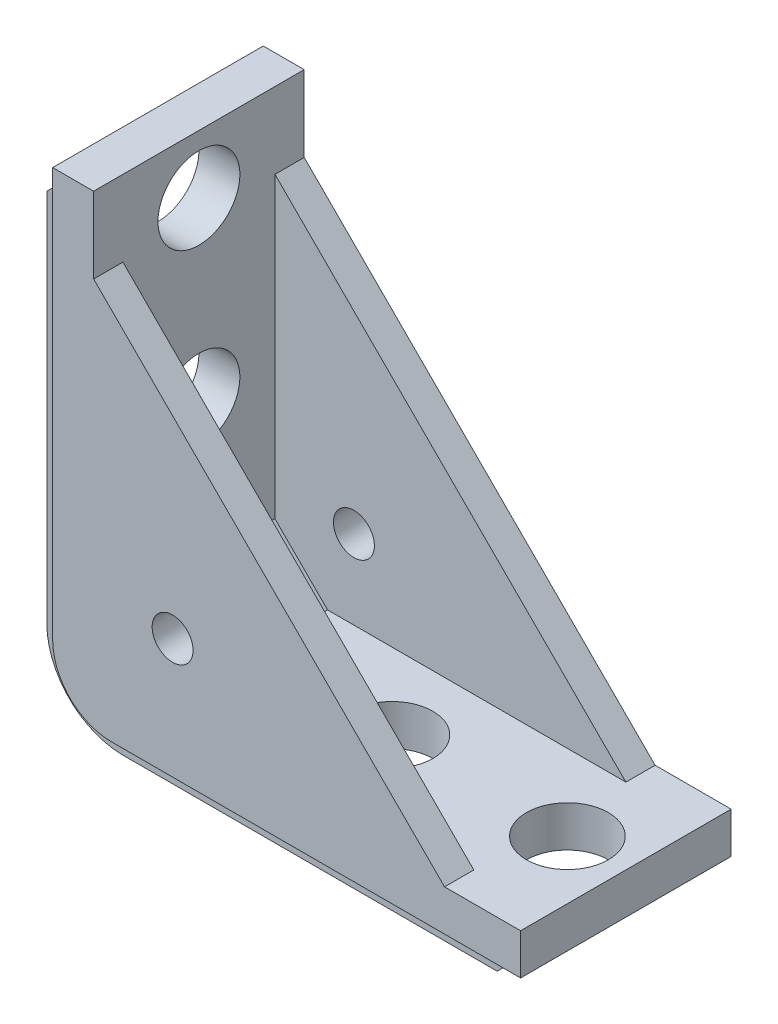
ISO-10303-21;
HEADER;
FILE_DESCRIPTION(('STEP AP214'),'2;1');
FILE_NAME('part.step','',(''),(''),'','','');
FILE_SCHEMA(('AUTOMOTIVE_DESIGN { 1 0 10303 214 1 1 1 1 }'));
ENDSEC;
DATA;
#1=APPLICATION_CONTEXT('core data for automotive mechanical design processes');
#2=APPLICATION_PROTOCOL_DEFINITION('international standard','automotive_design',2000,#1);
#3=PRODUCT_CONTEXT('',#1,'mechanical');
#4=PRODUCT('Part','Part','',(#3));
#5=PRODUCT_RELATED_PRODUCT_CATEGORY('part','',(#4));
#6=PRODUCT_DEFINITION_FORMATION('','',#4);
#7=PRODUCT_DEFINITION_CONTEXT('part definition',#1,'design');
#8=PRODUCT_DEFINITION('design','',#6,#7);
#9=PRODUCT_DEFINITION_SHAPE('','',#8);
#10=(LENGTH_UNIT() NAMED_UNIT(*) SI_UNIT(.MILLI.,.METRE.));
#11=(NAMED_UNIT(*) PLANE_ANGLE_UNIT() SI_UNIT($,.RADIAN.));
#12=(NAMED_UNIT(*) SI_UNIT($,.STERADIAN.) SOLID_ANGLE_UNIT());
#13=UNCERTAINTY_MEASURE_WITH_UNIT(LENGTH_MEASURE(1.E-05),#10,'distance_accuracy_value','');
#14=(GEOMETRIC_REPRESENTATION_CONTEXT(3) GLOBAL_UNCERTAINTY_ASSIGNED_CONTEXT((#13)) GLOBAL_UNIT_ASSIGNED_CONTEXT((#10,
#11,#12)) REPRESENTATION_CONTEXT('',''));
#15=CARTESIAN_POINT('',(0.,0.,0.));
#16=DIRECTION('',(0.,0.,1.));
#17=DIRECTION('',(1.,0.,0.));
#18=AXIS2_PLACEMENT_3D('',#15,#16,#17);
#19=CARTESIAN_POINT('',(35.,5.,-41.5));
#20=DIRECTION('',(-0.707106781186548,-0.707106781186547,0.));
#21=DIRECTION('',(0.707106781186547,-0.707106781186548,0.));
#22=AXIS2_PLACEMENT_3D('',#19,#20,#21);
#23=PLANE('',#22);
#24=DIRECTION('',(-0.707106781186547,0.707106781186548,0.));
#25=VECTOR('',#24,1.);
#26=CARTESIAN_POINT('',(35.,5.,-15.5));
#27=LINE('',#26,#25);
#28=CARTESIAN_POINT('',(35.,5.,-15.5));
#29=VERTEX_POINT('',#28);
#30=CARTESIAN_POINT('',(5.,35.,-15.5));
#31=VERTEX_POINT('',#30);
#32=EDGE_CURVE('E261',#29,#31,#27,.T.);
#33=ORIENTED_EDGE('',*,*,#32,.F.);
#34=DIRECTION('',(0.,0.,1.));
#35=VECTOR('',#34,1.);
#36=CARTESIAN_POINT('',(35.,5.,-41.5));
#37=LINE('',#36,#35);
#38=CARTESIAN_POINT('',(35.,5.,-18.));
#39=VERTEX_POINT('',#38);
#40=EDGE_CURVE('E341',#39,#29,#37,.T.);
#41=ORIENTED_EDGE('',*,*,#40,.F.);
#42=DIRECTION('',(0.707106781186547,-0.707106781186548,0.));
#43=VECTOR('',#42,1.);
#44=CARTESIAN_POINT('',(-0.75,40.75,-18.));
#45=LINE('',#44,#43);
#46=CARTESIAN_POINT('',(5.,35.,-18.));
#47=VERTEX_POINT('',#46);
#48=EDGE_CURVE('E362',#47,#39,#45,.T.);
#49=ORIENTED_EDGE('',*,*,#48,.F.);
#50=DIRECTION('',(0.,0.,1.));
#51=VECTOR('',#50,1.);
#52=CARTESIAN_POINT('',(5.,35.,-41.5));
#53=LINE('',#52,#51);
#54=EDGE_CURVE('E333',#47,#31,#53,.T.);
#55=ORIENTED_EDGE('',*,*,#54,.T.);
#56=EDGE_LOOP('',(#33,#41,#49,#55));
#57=FACE_BOUND('',#56,.T.);
#58=ADVANCED_FACE('F42',(#57),#23,.F.);
#59=CARTESIAN_POINT('',(0.,0.,-18.));
#60=DIRECTION('',(0.,-1.,0.));
#61=DIRECTION('',(0.,0.,-1.));
#62=AXIS2_PLACEMENT_3D('',#59,#60,#61);
#63=PLANE('',#62);
#64=DIRECTION('',(-1.,0.,0.));
#65=VECTOR('',#64,1.);
#66=CARTESIAN_POINT('',(0.,0.,-4.));
#67=LINE('',#66,#65);
#68=CARTESIAN_POINT('',(38.5,0.,-4.));
#69=VERTEX_POINT('',#68);
#70=CARTESIAN_POINT('',(6.5,0.,-4.));
#71=VERTEX_POINT('',#70);
#72=EDGE_CURVE('E295',#69,#71,#67,.T.);
#73=ORIENTED_EDGE('',*,*,#72,.F.);
#74=DIRECTION('',(0.,0.,1.));
#75=VECTOR('',#74,1.);
#76=CARTESIAN_POINT('',(38.5,0.,-18.));
#77=LINE('',#76,#75);
#78=CARTESIAN_POINT('',(38.5,0.,-1.));
#79=VERTEX_POINT('',#78);
#80=EDGE_CURVE('E417',#69,#79,#77,.T.);
#81=ORIENTED_EDGE('',*,*,#80,.T.);
#82=DIRECTION('',(1.,0.,0.));
#83=VECTOR('',#82,1.);
#84=CARTESIAN_POINT('',(0.,0.,-1.));
#85=LINE('',#84,#83);
#86=CARTESIAN_POINT('',(6.5,0.,-1.));
#87=VERTEX_POINT('',#86);
#88=EDGE_CURVE('E365',#87,#79,#85,.T.);
#89=ORIENTED_EDGE('',*,*,#88,.F.);
#90=DIRECTION('',(0.,0.,1.));
#91=VECTOR('',#90,1.);
#92=CARTESIAN_POINT('',(6.5,0.,-4.));
#93=LINE('',#92,#91);
#94=EDGE_CURVE('E373',#87,#71,#93,.F.);
#95=ORIENTED_EDGE('',*,*,#94,.T.);
#96=EDGE_LOOP('',(#73,#81,#89,#95));
#97=FACE_BOUND('',#96,.T.);
#98=ADVANCED_FACE('F488',(#97),#63,.T.);
#99=CARTESIAN_POINT('',(1.5,43.,1.5));
#100=DIRECTION('',(1.,0.,0.));
#101=DIRECTION('',(0.,0.,-1.));
#102=AXIS2_PLACEMENT_3D('',#99,#100,#101);
#103=PLANE('',#102);
#104=CARTESIAN_POINT('',(1.5,36.5,-9.));
#105=DIRECTION('',(-1.,0.,0.));
#106=DIRECTION('',(0.,0.,1.));
#107=AXIS2_PLACEMENT_3D('',#104,#105,#106);
#108=CIRCLE('',#107,3.5);
#109=CARTESIAN_POINT('',(1.5,36.5,-5.5));
#110=VERTEX_POINT('',#109);
#111=EDGE_CURVE('E446',#110,#110,#108,.T.);
#112=ORIENTED_EDGE('',*,*,#111,.F.);
#113=EDGE_LOOP('',(#112));
#114=FACE_BOUND('',#113,.T.);
#115=CARTESIAN_POINT('',(1.5,21.5,-9.));
#116=DIRECTION('',(-1.,0.,0.));
#117=DIRECTION('',(0.,0.,1.));
#118=AXIS2_PLACEMENT_3D('',#115,#116,#117);
#119=CIRCLE('',#118,3.5);
#120=CARTESIAN_POINT('',(1.5,21.5,-5.5));
#121=VERTEX_POINT('',#120);
#122=EDGE_CURVE('E443',#121,#121,#119,.T.);
#123=ORIENTED_EDGE('',*,*,#122,.F.);
#124=EDGE_LOOP('',(#123));
#125=FACE_BOUND('',#124,.T.);
#126=DIRECTION('',(0.,-1.,0.));
#127=VECTOR('',#126,1.);
#128=CARTESIAN_POINT('',(1.5,40.,-1.));
#129=LINE('',#128,#127);
#130=CARTESIAN_POINT('',(1.5,40.,-1.));
#131=VERTEX_POINT('',#130);
#132=CARTESIAN_POINT('',(1.5,6.5,-1.));
#133=VERTEX_POINT('',#132);
#134=EDGE_CURVE('E312',#131,#133,#129,.T.);
#135=ORIENTED_EDGE('',*,*,#134,.T.);
#136=DIRECTION('',(0.,0.,1.));
#137=VECTOR('',#136,1.);
#138=CARTESIAN_POINT('',(1.5,6.5,1.5));
#139=LINE('',#138,#137);
#140=CARTESIAN_POINT('',(1.5,6.5,0.));
#141=VERTEX_POINT('',#140);
#142=EDGE_CURVE('E387',#133,#141,#139,.T.);
#143=ORIENTED_EDGE('',*,*,#142,.T.);
#144=DIRECTION('',(0.,-1.,0.));
#145=VECTOR('',#144,1.);
#146=CARTESIAN_POINT('',(1.5,41.5,0.));
#147=LINE('',#146,#145);
#148=CARTESIAN_POINT('',(1.5,41.5,0.));
#149=VERTEX_POINT('',#148);
#150=EDGE_CURVE('E315',#149,#141,#147,.T.);
#151=ORIENTED_EDGE('',*,*,#150,.F.);
#152=DIRECTION('',(0.,0.,1.));
#153=VECTOR('',#152,1.);
#154=CARTESIAN_POINT('',(1.5,41.5,-18.));
#155=LINE('',#154,#153);
#156=CARTESIAN_POINT('',(1.5,41.5,-18.));
#157=VERTEX_POINT('',#156);
#158=EDGE_CURVE('E320',#157,#149,#155,.T.);
#159=ORIENTED_EDGE('',*,*,#158,.F.);
#160=DIRECTION('',(0.,1.,0.));
#161=VECTOR('',#160,1.);
#162=CARTESIAN_POINT('',(1.5,41.5,-18.));
#163=LINE('',#162,#161);
#164=CARTESIAN_POINT('',(1.5,6.5,-18.));
#165=VERTEX_POINT('',#164);
#166=EDGE_CURVE('E322',#165,#157,#163,.T.);
#167=ORIENTED_EDGE('',*,*,#166,.F.);
#168=DIRECTION('',(0.,0.,1.));
#169=VECTOR('',#168,1.);
#170=CARTESIAN_POINT('',(1.5,6.5,1.5));
#171=LINE('',#170,#169);
#172=CARTESIAN_POINT('',(1.5,6.5,-17.));
#173=VERTEX_POINT('',#172);
#174=EDGE_CURVE('E382',#165,#173,#171,.T.);
#175=ORIENTED_EDGE('',*,*,#174,.T.);
#176=DIRECTION('',(0.,1.,0.));
#177=VECTOR('',#176,1.);
#178=CARTESIAN_POINT('',(1.5,40.,-17.));
#179=LINE('',#178,#177);
#180=CARTESIAN_POINT('',(1.5,40.,-17.));
#181=VERTEX_POINT('',#180);
#182=EDGE_CURVE('E304',#173,#181,#179,.T.);
#183=ORIENTED_EDGE('',*,*,#182,.T.);
#184=DIRECTION('',(0.,0.,1.));
#185=VECTOR('',#184,1.);
#186=CARTESIAN_POINT('',(1.5,40.,-17.));
#187=LINE('',#186,#185);
#188=CARTESIAN_POINT('',(1.5,40.,-14.));
#189=VERTEX_POINT('',#188);
#190=EDGE_CURVE('E309',#181,#189,#187,.T.);
#191=ORIENTED_EDGE('',*,*,#190,.T.);
#192=DIRECTION('',(0.,-1.,0.));
#193=VECTOR('',#192,1.);
#194=CARTESIAN_POINT('',(1.5,-1.30665241122766,-14.));
#195=LINE('',#194,#193);
#196=CARTESIAN_POINT('',(1.5,6.5,-14.));
#197=VERTEX_POINT('',#196);
#198=EDGE_CURVE('E288',#189,#197,#195,.T.);
#199=ORIENTED_EDGE('',*,*,#198,.T.);
#200=DIRECTION('',(0.,0.,-1.));
#201=VECTOR('',#200,1.);
#202=CARTESIAN_POINT('',(1.5,6.5,1.5));
#203=LINE('',#202,#201);
#204=CARTESIAN_POINT('',(1.5,6.5,-4.));
#205=VERTEX_POINT('',#204);
#206=EDGE_CURVE('E385',#197,#205,#203,.F.);
#207=ORIENTED_EDGE('',*,*,#206,.T.);
#208=DIRECTION('',(0.,1.,0.));
#209=VECTOR('',#208,1.);
#210=CARTESIAN_POINT('',(1.5,41.5,-4.));
#211=LINE('',#210,#209);
#212=CARTESIAN_POINT('',(1.5,40.,-4.));
#213=VERTEX_POINT('',#212);
#214=EDGE_CURVE('E291',#205,#213,#211,.T.);
#215=ORIENTED_EDGE('',*,*,#214,.T.);
#216=EDGE_CURVE('E307',#213,#131,#187,.T.);
#217=ORIENTED_EDGE('',*,*,#216,.T.);
#218=EDGE_LOOP('',(#135,#143,#151,#159,#167,#175,#183,#191,#199,#207,#215,#217));
#219=FACE_BOUND('',#218,.T.);
#220=ADVANCED_FACE('F495',(#114,#125,#219),#103,.F.);
#221=DIRECTION('',(-1.,0.,0.));
#222=VECTOR('',#221,1.);
#223=CARTESIAN_POINT('',(0.,0.,-17.));
#224=LINE('',#223,#222);
#225=CARTESIAN_POINT('',(38.5,0.,-17.));
#226=VERTEX_POINT('',#225);
#227=CARTESIAN_POINT('',(6.5,0.,-17.));
#228=VERTEX_POINT('',#227);
#229=EDGE_CURVE('E368',#226,#228,#224,.T.);
#230=ORIENTED_EDGE('',*,*,#229,.F.);
#231=DIRECTION('',(0.,0.,1.));
#232=VECTOR('',#231,1.);
#233=CARTESIAN_POINT('',(38.5,0.,-18.));
#234=LINE('',#233,#232);
#235=CARTESIAN_POINT('',(38.5,0.,-14.));
#236=VERTEX_POINT('',#235);
#237=EDGE_CURVE('E428',#226,#236,#234,.T.);
#238=ORIENTED_EDGE('',*,*,#237,.T.);
#239=DIRECTION('',(1.,0.,0.));
#240=VECTOR('',#239,1.);
#241=CARTESIAN_POINT('',(0.,0.,-14.));
#242=LINE('',#241,#240);
#243=CARTESIAN_POINT('',(6.5,0.,-14.));
#244=VERTEX_POINT('',#243);
#245=EDGE_CURVE('E300',#244,#236,#242,.T.);
#246=ORIENTED_EDGE('',*,*,#245,.F.);
#247=DIRECTION('',(0.,0.,1.));
#248=VECTOR('',#247,1.);
#249=CARTESIAN_POINT('',(6.5,0.,-17.));
#250=LINE('',#249,#248);
#251=EDGE_CURVE('E379',#244,#228,#250,.F.);
#252=ORIENTED_EDGE('',*,*,#251,.T.);
#253=EDGE_LOOP('',(#230,#238,#246,#252));
#254=FACE_BOUND('',#253,.T.);
#255=ADVANCED_FACE('F498',(#254),#63,.T.);
#256=CARTESIAN_POINT('',(0.,41.5,0.));
#257=DIRECTION('',(1.,0.,0.));
#258=DIRECTION('',(0.,0.,-1.));
#259=AXIS2_PLACEMENT_3D('',#256,#257,#258);
#260=PLANE('',#259);
#261=DIRECTION('',(0.,-1.,0.));
#262=VECTOR('',#261,1.);
#263=CARTESIAN_POINT('',(0.,-1.30665241122766,-14.));
#264=LINE('',#263,#262);
#265=CARTESIAN_POINT('',(0.,38.5,-14.));
#266=VERTEX_POINT('',#265);
#267=CARTESIAN_POINT('',(0.,6.5,-14.));
#268=VERTEX_POINT('',#267);
#269=EDGE_CURVE('E287',#266,#268,#264,.T.);
#270=ORIENTED_EDGE('',*,*,#269,.F.);
#271=DIRECTION('',(0.,0.,-1.));
#272=VECTOR('',#271,1.);
#273=CARTESIAN_POINT('',(0.,38.5,0.));
#274=LINE('',#273,#272);
#275=CARTESIAN_POINT('',(0.,38.5,-17.));
#276=VERTEX_POINT('',#275);
#277=EDGE_CURVE('E51',#266,#276,#274,.T.);
#278=ORIENTED_EDGE('',*,*,#277,.T.);
#279=DIRECTION('',(0.,1.,0.));
#280=VECTOR('',#279,1.);
#281=CARTESIAN_POINT('',(0.,40.,-17.));
#282=LINE('',#281,#280);
#283=CARTESIAN_POINT('',(0.,6.5,-17.));
#284=VERTEX_POINT('',#283);
#285=EDGE_CURVE('E303',#284,#276,#282,.T.);
#286=ORIENTED_EDGE('',*,*,#285,.F.);
#287=DIRECTION('',(0.,0.,1.));
#288=VECTOR('',#287,1.);
#289=CARTESIAN_POINT('',(0.,6.5,-14.));
#290=LINE('',#289,#288);
#291=EDGE_CURVE('E376',#284,#268,#290,.T.);
#292=ORIENTED_EDGE('',*,*,#291,.T.);
#293=EDGE_LOOP('',(#270,#278,#286,#292));
#294=FACE_BOUND('',#293,.T.);
#295=ADVANCED_FACE('F581',(#294),#260,.F.);
#296=DIRECTION('',(0.,-1.,0.));
#297=VECTOR('',#296,1.);
#298=CARTESIAN_POINT('',(0.,40.,-1.));
#299=LINE('',#298,#297);
#300=CARTESIAN_POINT('',(0.,38.5,-1.));
#301=VERTEX_POINT('',#300);
#302=CARTESIAN_POINT('',(0.,6.5,-1.));
#303=VERTEX_POINT('',#302);
#304=EDGE_CURVE('E308',#301,#303,#299,.T.);
#305=ORIENTED_EDGE('',*,*,#304,.F.);
#306=DIRECTION('',(0.,0.,-1.));
#307=VECTOR('',#306,1.);
#308=CARTESIAN_POINT('',(0.,38.5,0.));
#309=LINE('',#308,#307);
#310=CARTESIAN_POINT('',(0.,38.5,-4.));
#311=VERTEX_POINT('',#310);
#312=EDGE_CURVE('E13',#301,#311,#309,.T.);
#313=ORIENTED_EDGE('',*,*,#312,.T.);
#314=DIRECTION('',(0.,1.,0.));
#315=VECTOR('',#314,1.);
#316=CARTESIAN_POINT('',(0.,41.5,-4.));
#317=LINE('',#316,#315);
#318=CARTESIAN_POINT('',(0.,6.5,-4.));
#319=VERTEX_POINT('',#318);
#320=EDGE_CURVE('E292',#319,#311,#317,.T.);
#321=ORIENTED_EDGE('',*,*,#320,.F.);
#322=DIRECTION('',(0.,0.,1.));
#323=VECTOR('',#322,1.);
#324=CARTESIAN_POINT('',(0.,6.5,-1.));
#325=LINE('',#324,#323);
#326=EDGE_CURVE('E370',#319,#303,#325,.T.);
#327=ORIENTED_EDGE('',*,*,#326,.T.);
#328=EDGE_LOOP('',(#305,#313,#321,#327));
#329=FACE_BOUND('',#328,.T.);
#330=ADVANCED_FACE('F647',(#329),#260,.F.);
#331=CARTESIAN_POINT('',(0.,41.5,0.));
#332=DIRECTION('',(0.,0.,-1.));
#333=DIRECTION('',(-1.,0.,0.));
#334=AXIS2_PLACEMENT_3D('',#331,#332,#333);
#335=PLANE('',#334);
#336=CARTESIAN_POINT('',(11.75,11.75,0.));
#337=DIRECTION('',(0.,0.,1.));
#338=DIRECTION('',(1.,0.,0.));
#339=AXIS2_PLACEMENT_3D('',#336,#337,#338);
#340=CIRCLE('',#339,1.75);
#341=CARTESIAN_POINT('',(13.5,11.75,0.));
#342=VERTEX_POINT('',#341);
#343=EDGE_CURVE('E924',#342,#342,#340,.T.);
#344=ORIENTED_EDGE('',*,*,#343,.F.);
#345=EDGE_LOOP('',(#344));
#346=FACE_BOUND('',#345,.T.);
#347=ORIENTED_EDGE('',*,*,#150,.T.);
#348=CARTESIAN_POINT('',(6.5,6.5,0.));
#349=DIRECTION('',(0.,0.,-1.));
#350=DIRECTION('',(-1.,0.,0.));
#351=AXIS2_PLACEMENT_3D('',#348,#349,#350);
#352=CIRCLE('',#351,5.);
#353=CARTESIAN_POINT('',(6.5,1.5,0.));
#354=VERTEX_POINT('',#353);
#355=EDGE_CURVE('E390',#141,#354,#352,.F.);
#356=ORIENTED_EDGE('',*,*,#355,.T.);
#357=DIRECTION('',(1.,0.,0.));
#358=VECTOR('',#357,1.);
#359=CARTESIAN_POINT('',(0.,1.5,0.));
#360=LINE('',#359,#358);
#361=CARTESIAN_POINT('',(41.5,1.5,0.));
#362=VERTEX_POINT('',#361);
#363=EDGE_CURVE('E280',#354,#362,#360,.T.);
#364=ORIENTED_EDGE('',*,*,#363,.T.);
#365=DIRECTION('',(0.,-1.,0.));
#366=VECTOR('',#365,1.);
#367=CARTESIAN_POINT('',(41.5,41.5,0.));
#368=LINE('',#367,#366);
#369=CARTESIAN_POINT('',(41.5,5.,0.));
#370=VERTEX_POINT('',#369);
#371=EDGE_CURVE('E353',#370,#362,#368,.T.);
#372=ORIENTED_EDGE('',*,*,#371,.F.);
#373=DIRECTION('',(1.,0.,0.));
#374=VECTOR('',#373,1.);
#375=CARTESIAN_POINT('',(35.,5.,0.));
#376=LINE('',#375,#374);
#377=CARTESIAN_POINT('',(35.,5.,0.));
#378=VERTEX_POINT('',#377);
#379=EDGE_CURVE('E327',#378,#370,#376,.T.);
#380=ORIENTED_EDGE('',*,*,#379,.F.);
#381=DIRECTION('',(0.707106781186547,-0.707106781186548,0.));
#382=VECTOR('',#381,1.);
#383=CARTESIAN_POINT('',(35.,5.,0.));
#384=LINE('',#383,#382);
#385=CARTESIAN_POINT('',(5.,35.,0.));
#386=VERTEX_POINT('',#385);
#387=EDGE_CURVE('E324',#386,#378,#384,.T.);
#388=ORIENTED_EDGE('',*,*,#387,.F.);
#389=DIRECTION('',(0.,-1.,0.));
#390=VECTOR('',#389,1.);
#391=CARTESIAN_POINT('',(5.,41.5,0.));
#392=LINE('',#391,#390);
#393=CARTESIAN_POINT('',(5.,41.5,0.));
#394=VERTEX_POINT('',#393);
#395=EDGE_CURVE('E329',#394,#386,#392,.T.);
#396=ORIENTED_EDGE('',*,*,#395,.F.);
#397=DIRECTION('',(1.,0.,0.));
#398=VECTOR('',#397,1.);
#399=CARTESIAN_POINT('',(0.,41.5,0.));
#400=LINE('',#399,#398);
#401=EDGE_CURVE('E345',#149,#394,#400,.T.);
#402=ORIENTED_EDGE('',*,*,#401,.F.);
#403=EDGE_LOOP('',(#347,#356,#364,#372,#380,#388,#396,#402));
#404=FACE_BOUND('',#403,.T.);
#405=ADVANCED_FACE('F520',(#346,#404),#335,.F.);
#406=CARTESIAN_POINT('',(41.5,41.5,0.));
#407=DIRECTION('',(-1.,0.,0.));
#408=DIRECTION('',(0.,0.,1.));
#409=AXIS2_PLACEMENT_3D('',#406,#407,#408);
#410=PLANE('',#409);
#411=ORIENTED_EDGE('',*,*,#371,.T.);
#412=DIRECTION('',(0.,0.,-1.));
#413=VECTOR('',#412,1.);
#414=CARTESIAN_POINT('',(41.5,1.5,0.));
#415=LINE('',#414,#413);
#416=CARTESIAN_POINT('',(41.5,1.5,-18.));
#417=VERTEX_POINT('',#416);
#418=EDGE_CURVE('E282',#362,#417,#415,.T.);
#419=ORIENTED_EDGE('',*,*,#418,.T.);
#420=DIRECTION('',(0.,-1.,0.));
#421=VECTOR('',#420,1.);
#422=CARTESIAN_POINT('',(41.5,41.5,-18.));
#423=LINE('',#422,#421);
#424=CARTESIAN_POINT('',(41.5,5.,-18.));
#425=VERTEX_POINT('',#424);
#426=EDGE_CURVE('E350',#425,#417,#423,.T.);
#427=ORIENTED_EDGE('',*,*,#426,.F.);
#428=DIRECTION('',(0.,0.,1.));
#429=VECTOR('',#428,1.);
#430=CARTESIAN_POINT('',(41.5,5.,-41.5));
#431=LINE('',#430,#429);
#432=EDGE_CURVE('E338',#425,#370,#431,.T.);
#433=ORIENTED_EDGE('',*,*,#432,.T.);
#434=EDGE_LOOP('',(#411,#419,#427,#433));
#435=FACE_BOUND('',#434,.T.);
#436=ADVANCED_FACE('F519',(#435),#410,.F.);
#437=CARTESIAN_POINT('',(0.,41.5,-18.));
#438=DIRECTION('',(0.,0.,1.));
#439=DIRECTION('',(1.,0.,0.));
#440=AXIS2_PLACEMENT_3D('',#437,#438,#439);
#441=PLANE('',#440);
#442=CARTESIAN_POINT('',(11.75,11.75,-18.));
#443=DIRECTION('',(0.,0.,1.));
#444=DIRECTION('',(1.,0.,0.));
#445=AXIS2_PLACEMENT_3D('',#442,#443,#444);
#446=CIRCLE('',#445,1.75);
#447=CARTESIAN_POINT('',(13.5,11.75,-18.));
#448=VERTEX_POINT('',#447);
#449=EDGE_CURVE('E452',#448,#448,#446,.T.);
#450=ORIENTED_EDGE('',*,*,#449,.T.);
#451=EDGE_LOOP('',(#450));
#452=FACE_BOUND('',#451,.T.);
#453=DIRECTION('',(-1.,0.,0.));
#454=VECTOR('',#453,1.);
#455=CARTESIAN_POINT('',(0.,1.5,-18.));
#456=LINE('',#455,#454);
#457=CARTESIAN_POINT('',(6.5,1.5,-18.));
#458=VERTEX_POINT('',#457);
#459=EDGE_CURVE('E284',#417,#458,#456,.T.);
#460=ORIENTED_EDGE('',*,*,#459,.T.);
#461=CARTESIAN_POINT('',(6.5,6.5,-18.));
#462=DIRECTION('',(0.,0.,1.));
#463=DIRECTION('',(1.,0.,0.));
#464=AXIS2_PLACEMENT_3D('',#461,#462,#463);
#465=CIRCLE('',#464,5.);
#466=EDGE_CURVE('E399',#458,#165,#465,.F.);
#467=ORIENTED_EDGE('',*,*,#466,.T.);
#468=ORIENTED_EDGE('',*,*,#166,.T.);
#469=DIRECTION('',(-1.,0.,0.));
#470=VECTOR('',#469,1.);
#471=CARTESIAN_POINT('',(0.,41.5,-18.));
#472=LINE('',#471,#470);
#473=CARTESIAN_POINT('',(5.,41.5,-18.));
#474=VERTEX_POINT('',#473);
#475=EDGE_CURVE('E347',#474,#157,#472,.T.);
#476=ORIENTED_EDGE('',*,*,#475,.F.);
#477=DIRECTION('',(0.,-1.,0.));
#478=VECTOR('',#477,1.);
#479=CARTESIAN_POINT('',(5.,41.5,-18.));
#480=LINE('',#479,#478);
#481=EDGE_CURVE('E336',#474,#47,#480,.T.);
#482=ORIENTED_EDGE('',*,*,#481,.T.);
#483=ORIENTED_EDGE('',*,*,#48,.T.);
#484=DIRECTION('',(1.,0.,0.));
#485=VECTOR('',#484,1.);
#486=CARTESIAN_POINT('',(0.,4.99999999999999,-18.));
#487=LINE('',#486,#485);
#488=EDGE_CURVE('E359',#39,#425,#487,.T.);
#489=ORIENTED_EDGE('',*,*,#488,.T.);
#490=ORIENTED_EDGE('',*,*,#426,.T.);
#491=EDGE_LOOP('',(#460,#467,#468,#476,#482,#483,#489,#490));
#492=FACE_BOUND('',#491,.T.);
#493=ADVANCED_FACE('F510',(#452,#492),#441,.F.);
#494=CARTESIAN_POINT('',(0.,41.5,-18.));
#495=DIRECTION('',(0.,-1.,0.));
#496=DIRECTION('',(0.,0.,-1.));
#497=AXIS2_PLACEMENT_3D('',#494,#495,#496);
#498=PLANE('',#497);
#499=ORIENTED_EDGE('',*,*,#475,.T.);
#500=ORIENTED_EDGE('',*,*,#158,.T.);
#501=ORIENTED_EDGE('',*,*,#401,.T.);
#502=DIRECTION('',(0.,0.,-1.));
#503=VECTOR('',#502,1.);
#504=CARTESIAN_POINT('',(5.,41.5,-18.));
#505=LINE('',#504,#503);
#506=EDGE_CURVE('E356',#394,#474,#505,.T.);
#507=ORIENTED_EDGE('',*,*,#506,.T.);
#508=EDGE_LOOP('',(#499,#500,#501,#507));
#509=FACE_BOUND('',#508,.T.);
#510=ADVANCED_FACE('F502',(#509),#498,.F.);
#511=CARTESIAN_POINT('',(35.,5.,-2.5));
#512=VERTEX_POINT('',#511);
#513=EDGE_CURVE('E332',#512,#378,#37,.T.);
#514=ORIENTED_EDGE('',*,*,#513,.F.);
#515=DIRECTION('',(-0.707106781186547,0.707106781186548,0.));
#516=VECTOR('',#515,1.);
#517=CARTESIAN_POINT('',(35.,5.,-2.5));
#518=LINE('',#517,#516);
#519=CARTESIAN_POINT('',(5.,35.,-2.5));
#520=VERTEX_POINT('',#519);
#521=EDGE_CURVE('E235',#512,#520,#518,.T.);
#522=ORIENTED_EDGE('',*,*,#521,.T.);
#523=EDGE_CURVE('E337',#520,#386,#53,.T.);
#524=ORIENTED_EDGE('',*,*,#523,.T.);
#525=ORIENTED_EDGE('',*,*,#387,.T.);
#526=EDGE_LOOP('',(#514,#522,#524,#525));
#527=FACE_BOUND('',#526,.T.);
#528=ADVANCED_FACE('F491',(#527),#23,.F.);
#529=CARTESIAN_POINT('',(35.,5.,-41.5));
#530=DIRECTION('',(0.,-1.,0.));
#531=DIRECTION('',(1.,0.,0.));
#532=AXIS2_PLACEMENT_3D('',#529,#530,#531);
#533=PLANE('',#532);
#534=CARTESIAN_POINT('',(36.5,5.,-9.));
#535=DIRECTION('',(0.,-1.,0.));
#536=DIRECTION('',(1.,0.,0.));
#537=AXIS2_PLACEMENT_3D('',#534,#535,#536);
#538=CIRCLE('',#537,3.5);
#539=CARTESIAN_POINT('',(40.,5.,-9.));
#540=VERTEX_POINT('',#539);
#541=EDGE_CURVE('E463',#540,#540,#538,.T.);
#542=ORIENTED_EDGE('',*,*,#541,.T.);
#543=EDGE_LOOP('',(#542));
#544=FACE_BOUND('',#543,.T.);
#545=CARTESIAN_POINT('',(21.5,5.,-9.));
#546=DIRECTION('',(0.,-1.,0.));
#547=DIRECTION('',(1.,0.,0.));
#548=AXIS2_PLACEMENT_3D('',#545,#546,#547);
#549=CIRCLE('',#548,3.5);
#550=CARTESIAN_POINT('',(25.,5.,-9.));
#551=VERTEX_POINT('',#550);
#552=EDGE_CURVE('E257',#551,#551,#549,.T.);
#553=ORIENTED_EDGE('',*,*,#552,.T.);
#554=EDGE_LOOP('',(#553));
#555=FACE_BOUND('',#554,.T.);
#556=ORIENTED_EDGE('',*,*,#40,.T.);
#557=DIRECTION('',(-1.,0.,0.));
#558=VECTOR('',#557,1.);
#559=CARTESIAN_POINT('',(9.50000000000001,5.,-15.5));
#560=LINE('',#559,#558);
#561=CARTESIAN_POINT('',(9.50000000000001,5.,-15.5));
#562=VERTEX_POINT('',#561);
#563=EDGE_CURVE('E59',#29,#562,#560,.T.);
#564=ORIENTED_EDGE('',*,*,#563,.T.);
#565=DIRECTION('',(0.,0.,-1.));
#566=VECTOR('',#565,1.);
#567=CARTESIAN_POINT('',(9.50000000000001,5.,-2.5));
#568=LINE('',#567,#566);
#569=CARTESIAN_POINT('',(9.50000000000001,5.,-2.5));
#570=VERTEX_POINT('',#569);
#571=EDGE_CURVE('E241',#570,#562,#568,.T.);
#572=ORIENTED_EDGE('',*,*,#571,.F.);
#573=DIRECTION('',(-1.,0.,0.));
#574=VECTOR('',#573,1.);
#575=CARTESIAN_POINT('',(9.50000000000001,5.,-2.5));
#576=LINE('',#575,#574);
#577=EDGE_CURVE('E229',#512,#570,#576,.T.);
#578=ORIENTED_EDGE('',*,*,#577,.F.);
#579=ORIENTED_EDGE('',*,*,#513,.T.);
#580=ORIENTED_EDGE('',*,*,#379,.T.);
#581=ORIENTED_EDGE('',*,*,#432,.F.);
#582=ORIENTED_EDGE('',*,*,#488,.F.);
#583=EDGE_LOOP('',(#556,#564,#572,#578,#579,#580,#581,#582));
#584=FACE_BOUND('',#583,.T.);
#585=ADVANCED_FACE('F243',(#544,#555,#584),#533,.F.);
#586=CARTESIAN_POINT('',(5.,41.5,-41.5));
#587=DIRECTION('',(-1.,0.,0.));
#588=DIRECTION('',(0.,0.,1.));
#589=AXIS2_PLACEMENT_3D('',#586,#587,#588);
#590=PLANE('',#589);
#591=CARTESIAN_POINT('',(5.,36.5,-9.));
#592=DIRECTION('',(-1.,0.,0.));
#593=DIRECTION('',(0.,0.,1.));
#594=AXIS2_PLACEMENT_3D('',#591,#592,#593);
#595=CIRCLE('',#594,3.5);
#596=CARTESIAN_POINT('',(5.,36.5,-5.5));
#597=VERTEX_POINT('',#596);
#598=EDGE_CURVE('E444',#597,#597,#595,.T.);
#599=ORIENTED_EDGE('',*,*,#598,.T.);
#600=EDGE_LOOP('',(#599));
#601=FACE_BOUND('',#600,.T.);
#602=CARTESIAN_POINT('',(5.,21.5,-9.));
#603=DIRECTION('',(-1.,0.,0.));
#604=DIRECTION('',(0.,0.,1.));
#605=AXIS2_PLACEMENT_3D('',#602,#603,#604);
#606=CIRCLE('',#605,3.5);
#607=CARTESIAN_POINT('',(5.,21.5,-5.5));
#608=VERTEX_POINT('',#607);
#609=EDGE_CURVE('E440',#608,#608,#606,.T.);
#610=ORIENTED_EDGE('',*,*,#609,.T.);
#611=EDGE_LOOP('',(#610));
#612=FACE_BOUND('',#611,.T.);
#613=ORIENTED_EDGE('',*,*,#523,.F.);
#614=DIRECTION('',(0.,1.,0.));
#615=VECTOR('',#614,1.);
#616=CARTESIAN_POINT('',(5.,38.8989286254729,-2.5));
#617=LINE('',#616,#615);
#618=CARTESIAN_POINT('',(5.,9.49999999999997,-2.5));
#619=VERTEX_POINT('',#618);
#620=EDGE_CURVE('E247',#619,#520,#617,.T.);
#621=ORIENTED_EDGE('',*,*,#620,.F.);
#622=DIRECTION('',(0.,0.,-1.));
#623=VECTOR('',#622,1.);
#624=CARTESIAN_POINT('',(5.,9.49999999999997,-2.5));
#625=LINE('',#624,#623);
#626=CARTESIAN_POINT('',(5.,9.49999999999997,-15.5));
#627=VERTEX_POINT('',#626);
#628=EDGE_CURVE('E246',#619,#627,#625,.T.);
#629=ORIENTED_EDGE('',*,*,#628,.T.);
#630=DIRECTION('',(0.,1.,0.));
#631=VECTOR('',#630,1.);
#632=CARTESIAN_POINT('',(5.,38.8989286254729,-15.5));
#633=LINE('',#632,#631);
#634=EDGE_CURVE('E238',#627,#31,#633,.T.);
#635=ORIENTED_EDGE('',*,*,#634,.T.);
#636=ORIENTED_EDGE('',*,*,#54,.F.);
#637=ORIENTED_EDGE('',*,*,#481,.F.);
#638=ORIENTED_EDGE('',*,*,#506,.F.);
#639=ORIENTED_EDGE('',*,*,#395,.T.);
#640=EDGE_LOOP('',(#613,#621,#629,#635,#636,#637,#638,#639));
#641=FACE_BOUND('',#640,.T.);
#642=ADVANCED_FACE('F508',(#601,#612,#641),#590,.F.);
#643=CARTESIAN_POINT('',(1.5,40.,-1.));
#644=DIRECTION('',(0.,0.,-1.));
#645=DIRECTION('',(0.,1.,0.));
#646=AXIS2_PLACEMENT_3D('',#643,#644,#645);
#647=PLANE('',#646);
#648=ORIENTED_EDGE('',*,*,#88,.T.);
#649=DIRECTION('',(-0.707106781186546,-0.707106781186549,0.));
#650=VECTOR('',#649,1.);
#651=CARTESIAN_POINT('',(38.5,0.,-1.));
#652=LINE('',#651,#650);
#653=CARTESIAN_POINT('',(40.,1.5,-1.));
#654=VERTEX_POINT('',#653);
#655=EDGE_CURVE('E422',#79,#654,#652,.F.);
#656=ORIENTED_EDGE('',*,*,#655,.T.);
#657=DIRECTION('',(-1.,0.,0.));
#658=VECTOR('',#657,1.);
#659=CARTESIAN_POINT('',(-2.14622050233935,1.5,-1.));
#660=LINE('',#659,#658);
#661=CARTESIAN_POINT('',(6.5,1.5,-1.));
#662=VERTEX_POINT('',#661);
#663=EDGE_CURVE('E277',#654,#662,#660,.T.);
#664=ORIENTED_EDGE('',*,*,#663,.T.);
#665=CARTESIAN_POINT('',(6.5,6.5,-1.));
#666=DIRECTION('',(0.,0.,-1.));
#667=DIRECTION('',(0.,1.,0.));
#668=AXIS2_PLACEMENT_3D('',#665,#666,#667);
#669=CIRCLE('',#668,5.);
#670=EDGE_CURVE('E401',#662,#133,#669,.T.);
#671=ORIENTED_EDGE('',*,*,#670,.T.);
#672=ORIENTED_EDGE('',*,*,#134,.F.);
#673=DIRECTION('',(0.707106781186546,0.707106781186549,0.));
#674=VECTOR('',#673,1.);
#675=CARTESIAN_POINT('',(1.5,40.,-1.));
#676=LINE('',#675,#674);
#677=EDGE_CURVE('E420',#131,#301,#676,.F.);
#678=ORIENTED_EDGE('',*,*,#677,.T.);
#679=ORIENTED_EDGE('',*,*,#304,.T.);
#680=CARTESIAN_POINT('',(6.5,6.5,-1.));
#681=DIRECTION('',(0.,0.,-1.));
#682=DIRECTION('',(0.,1.,0.));
#683=AXIS2_PLACEMENT_3D('',#680,#681,#682);
#684=CIRCLE('',#683,6.5);
#685=EDGE_CURVE('E409',#303,#87,#684,.F.);
#686=ORIENTED_EDGE('',*,*,#685,.T.);
#687=EDGE_LOOP('',(#648,#656,#664,#671,#672,#678,#679,#686));
#688=FACE_BOUND('',#687,.T.);
#689=ADVANCED_FACE('F553',(#688),#647,.F.);
#690=CARTESIAN_POINT('',(1.5,40.,-17.));
#691=DIRECTION('',(0.,0.,1.));
#692=DIRECTION('',(0.,-1.,0.));
#693=AXIS2_PLACEMENT_3D('',#690,#691,#692);
#694=PLANE('',#693);
#695=DIRECTION('',(1.,0.,0.));
#696=VECTOR('',#695,1.);
#697=CARTESIAN_POINT('',(40.,1.5,-17.));
#698=LINE('',#697,#696);
#699=CARTESIAN_POINT('',(6.5,1.5,-17.));
#700=VERTEX_POINT('',#699);
#701=CARTESIAN_POINT('',(40.,1.5,-17.));
#702=VERTEX_POINT('',#701);
#703=EDGE_CURVE('E271',#700,#702,#698,.T.);
#704=ORIENTED_EDGE('',*,*,#703,.T.);
#705=DIRECTION('',(0.707106781186546,0.707106781186549,0.));
#706=VECTOR('',#705,1.);
#707=CARTESIAN_POINT('',(38.5,0.,-17.));
#708=LINE('',#707,#706);
#709=EDGE_CURVE('E437',#702,#226,#708,.F.);
#710=ORIENTED_EDGE('',*,*,#709,.T.);
#711=ORIENTED_EDGE('',*,*,#229,.T.);
#712=CARTESIAN_POINT('',(6.5,6.5,-17.));
#713=DIRECTION('',(0.,0.,1.));
#714=DIRECTION('',(0.,-1.,0.));
#715=AXIS2_PLACEMENT_3D('',#712,#713,#714);
#716=CIRCLE('',#715,6.5);
#717=EDGE_CURVE('E415',#228,#284,#716,.F.);
#718=ORIENTED_EDGE('',*,*,#717,.T.);
#719=ORIENTED_EDGE('',*,*,#285,.T.);
#720=DIRECTION('',(-0.707106781186546,-0.707106781186549,0.));
#721=VECTOR('',#720,1.);
#722=CARTESIAN_POINT('',(1.5,40.,-17.));
#723=LINE('',#722,#721);
#724=EDGE_CURVE('E435',#276,#181,#723,.F.);
#725=ORIENTED_EDGE('',*,*,#724,.T.);
#726=ORIENTED_EDGE('',*,*,#182,.F.);
#727=CARTESIAN_POINT('',(6.5,6.5,-17.));
#728=DIRECTION('',(0.,0.,1.));
#729=DIRECTION('',(0.,-1.,0.));
#730=AXIS2_PLACEMENT_3D('',#727,#728,#729);
#731=CIRCLE('',#730,5.);
#732=EDGE_CURVE('E407',#173,#700,#731,.T.);
#733=ORIENTED_EDGE('',*,*,#732,.T.);
#734=EDGE_LOOP('',(#704,#710,#711,#718,#719,#725,#726,#733));
#735=FACE_BOUND('',#734,.T.);
#736=ADVANCED_FACE('F599',(#735),#694,.F.);
#737=CARTESIAN_POINT('',(1.5,-1.30665241122766,-14.));
#738=DIRECTION('',(0.,0.,-1.));
#739=DIRECTION('',(0.,1.,0.));
#740=AXIS2_PLACEMENT_3D('',#737,#738,#739);
#741=PLANE('',#740);
#742=ORIENTED_EDGE('',*,*,#245,.T.);
#743=DIRECTION('',(-0.707106781186546,-0.707106781186549,0.));
#744=VECTOR('',#743,1.);
#745=CARTESIAN_POINT('',(38.5,0.,-14.));
#746=LINE('',#745,#744);
#747=CARTESIAN_POINT('',(40.,1.5,-14.));
#748=VERTEX_POINT('',#747);
#749=EDGE_CURVE('E433',#236,#748,#746,.F.);
#750=ORIENTED_EDGE('',*,*,#749,.T.);
#751=DIRECTION('',(1.,0.,0.));
#752=VECTOR('',#751,1.);
#753=CARTESIAN_POINT('',(-2.32830983078715,1.5,-14.));
#754=LINE('',#753,#752);
#755=CARTESIAN_POINT('',(6.5,1.5,-14.));
#756=VERTEX_POINT('',#755);
#757=EDGE_CURVE('E268',#756,#748,#754,.T.);
#758=ORIENTED_EDGE('',*,*,#757,.F.);
#759=CARTESIAN_POINT('',(6.5,6.5,-14.));
#760=DIRECTION('',(0.,0.,-1.));
#761=DIRECTION('',(0.,1.,0.));
#762=AXIS2_PLACEMENT_3D('',#759,#760,#761);
#763=CIRCLE('',#762,5.);
#764=EDGE_CURVE('E403',#756,#197,#763,.T.);
#765=ORIENTED_EDGE('',*,*,#764,.T.);
#766=ORIENTED_EDGE('',*,*,#198,.F.);
#767=DIRECTION('',(0.707106781186546,0.707106781186549,0.));
#768=VECTOR('',#767,1.);
#769=CARTESIAN_POINT('',(1.5,40.,-14.));
#770=LINE('',#769,#768);
#771=EDGE_CURVE('E431',#189,#266,#770,.F.);
#772=ORIENTED_EDGE('',*,*,#771,.T.);
#773=ORIENTED_EDGE('',*,*,#269,.T.);
#774=CARTESIAN_POINT('',(6.5,6.5,-14.));
#775=DIRECTION('',(0.,0.,-1.));
#776=DIRECTION('',(0.,1.,0.));
#777=AXIS2_PLACEMENT_3D('',#774,#775,#776);
#778=CIRCLE('',#777,6.5);
#779=EDGE_CURVE('E413',#268,#244,#778,.F.);
#780=ORIENTED_EDGE('',*,*,#779,.T.);
#781=EDGE_LOOP('',(#742,#750,#758,#765,#766,#772,#773,#780));
#782=FACE_BOUND('',#781,.T.);
#783=ADVANCED_FACE('F574',(#782),#741,.F.);
#784=CARTESIAN_POINT('',(1.5,41.5,-4.));
#785=DIRECTION('',(0.,0.,1.));
#786=DIRECTION('',(0.,-1.,0.));
#787=AXIS2_PLACEMENT_3D('',#784,#785,#786);
#788=PLANE('',#787);
#789=DIRECTION('',(-1.,0.,0.));
#790=VECTOR('',#789,1.);
#791=CARTESIAN_POINT('',(41.5,1.5,-4.));
#792=LINE('',#791,#790);
#793=CARTESIAN_POINT('',(40.,1.5,-4.));
#794=VERTEX_POINT('',#793);
#795=CARTESIAN_POINT('',(6.5,1.5,-4.));
#796=VERTEX_POINT('',#795);
#797=EDGE_CURVE('E265',#794,#796,#792,.T.);
#798=ORIENTED_EDGE('',*,*,#797,.F.);
#799=DIRECTION('',(0.707106781186546,0.707106781186549,0.));
#800=VECTOR('',#799,1.);
#801=CARTESIAN_POINT('',(38.5,0.,-4.));
#802=LINE('',#801,#800);
#803=EDGE_CURVE('E426',#794,#69,#802,.F.);
#804=ORIENTED_EDGE('',*,*,#803,.T.);
#805=ORIENTED_EDGE('',*,*,#72,.T.);
#806=CARTESIAN_POINT('',(6.5,6.5,-4.));
#807=DIRECTION('',(0.,0.,1.));
#808=DIRECTION('',(0.,-1.,0.));
#809=AXIS2_PLACEMENT_3D('',#806,#807,#808);
#810=CIRCLE('',#809,6.5);
#811=EDGE_CURVE('E411',#71,#319,#810,.F.);
#812=ORIENTED_EDGE('',*,*,#811,.T.);
#813=ORIENTED_EDGE('',*,*,#320,.T.);
#814=DIRECTION('',(-0.707106781186546,-0.707106781186549,0.));
#815=VECTOR('',#814,1.);
#816=CARTESIAN_POINT('',(1.5,40.,-4.));
#817=LINE('',#816,#815);
#818=EDGE_CURVE('E424',#311,#213,#817,.F.);
#819=ORIENTED_EDGE('',*,*,#818,.T.);
#820=ORIENTED_EDGE('',*,*,#214,.F.);
#821=CARTESIAN_POINT('',(6.5,6.5,-4.));
#822=DIRECTION('',(0.,0.,1.));
#823=DIRECTION('',(0.,-1.,0.));
#824=AXIS2_PLACEMENT_3D('',#821,#822,#823);
#825=CIRCLE('',#824,5.);
#826=EDGE_CURVE('E405',#205,#796,#825,.T.);
#827=ORIENTED_EDGE('',*,*,#826,.T.);
#828=EDGE_LOOP('',(#798,#804,#805,#812,#813,#819,#820,#827));
#829=FACE_BOUND('',#828,.T.);
#830=ADVANCED_FACE('F563',(#829),#788,.F.);
#831=CARTESIAN_POINT('',(42.5,1.5,-18.5));
#832=DIRECTION('',(0.,1.,0.));
#833=DIRECTION('',(0.,0.,1.));
#834=AXIS2_PLACEMENT_3D('',#831,#832,#833);
#835=PLANE('',#834);
#836=CARTESIAN_POINT('',(36.5,1.5,-9.));
#837=DIRECTION('',(0.,-1.,0.));
#838=DIRECTION('',(0.,0.,-1.));
#839=AXIS2_PLACEMENT_3D('',#836,#837,#838);
#840=CIRCLE('',#839,3.5);
#841=CARTESIAN_POINT('',(36.5,1.5,-12.5));
#842=VERTEX_POINT('',#841);
#843=EDGE_CURVE('E442',#842,#842,#840,.T.);
#844=ORIENTED_EDGE('',*,*,#843,.F.);
#845=EDGE_LOOP('',(#844));
#846=FACE_BOUND('',#845,.T.);
#847=CARTESIAN_POINT('',(21.5,1.5,-9.));
#848=DIRECTION('',(0.,-1.,0.));
#849=DIRECTION('',(0.,0.,-1.));
#850=AXIS2_PLACEMENT_3D('',#847,#848,#849);
#851=CIRCLE('',#850,3.5);
#852=CARTESIAN_POINT('',(21.5,1.5,-12.5));
#853=VERTEX_POINT('',#852);
#854=EDGE_CURVE('E466',#853,#853,#851,.T.);
#855=ORIENTED_EDGE('',*,*,#854,.F.);
#856=EDGE_LOOP('',(#855));
#857=FACE_BOUND('',#856,.T.);
#858=ORIENTED_EDGE('',*,*,#363,.F.);
#859=DIRECTION('',(0.,0.,1.));
#860=VECTOR('',#859,1.);
#861=CARTESIAN_POINT('',(6.5,1.5,-18.5));
#862=LINE('',#861,#860);
#863=EDGE_CURVE('E397',#354,#662,#862,.F.);
#864=ORIENTED_EDGE('',*,*,#863,.T.);
#865=ORIENTED_EDGE('',*,*,#663,.F.);
#866=DIRECTION('',(0.,0.,1.));
#867=VECTOR('',#866,1.);
#868=CARTESIAN_POINT('',(40.,1.5,-1.));
#869=LINE('',#868,#867);
#870=EDGE_CURVE('E273',#794,#654,#869,.T.);
#871=ORIENTED_EDGE('',*,*,#870,.F.);
#872=ORIENTED_EDGE('',*,*,#797,.T.);
#873=DIRECTION('',(0.,0.,-1.));
#874=VECTOR('',#873,1.);
#875=CARTESIAN_POINT('',(6.5,1.5,-18.5));
#876=LINE('',#875,#874);
#877=EDGE_CURVE('E394',#796,#756,#876,.T.);
#878=ORIENTED_EDGE('',*,*,#877,.T.);
#879=ORIENTED_EDGE('',*,*,#757,.T.);
#880=EDGE_CURVE('E274',#702,#748,#869,.T.);
#881=ORIENTED_EDGE('',*,*,#880,.F.);
#882=ORIENTED_EDGE('',*,*,#703,.F.);
#883=DIRECTION('',(0.,0.,1.));
#884=VECTOR('',#883,1.);
#885=CARTESIAN_POINT('',(6.5,1.5,-18.5));
#886=LINE('',#885,#884);
#887=EDGE_CURVE('E392',#700,#458,#886,.F.);
#888=ORIENTED_EDGE('',*,*,#887,.T.);
#889=ORIENTED_EDGE('',*,*,#459,.F.);
#890=ORIENTED_EDGE('',*,*,#418,.F.);
#891=EDGE_LOOP('',(#858,#864,#865,#871,#872,#878,#879,#881,#882,#888,#889,#890));
#892=FACE_BOUND('',#891,.T.);
#893=ADVANCED_FACE('F526',(#846,#857,#892),#835,.F.);
#894=CARTESIAN_POINT('',(6.5,6.5,0.));
#895=DIRECTION('',(0.,0.,-1.));
#896=DIRECTION('',(-1.,0.,0.));
#897=AXIS2_PLACEMENT_3D('',#894,#895,#896);
#898=CYLINDRICAL_SURFACE('',#897,6.5);
#899=ORIENTED_EDGE('',*,*,#811,.F.);
#900=ORIENTED_EDGE('',*,*,#94,.F.);
#901=ORIENTED_EDGE('',*,*,#685,.F.);
#902=ORIENTED_EDGE('',*,*,#326,.F.);
#903=EDGE_LOOP('',(#899,#900,#901,#902));
#904=FACE_BOUND('',#903,.T.);
#905=ADVANCED_FACE('F652',(#904),#898,.T.);
#906=CARTESIAN_POINT('',(6.5,6.5,0.));
#907=DIRECTION('',(0.,0.,-1.));
#908=DIRECTION('',(-1.,0.,0.));
#909=AXIS2_PLACEMENT_3D('',#906,#907,#908);
#910=CYLINDRICAL_SURFACE('',#909,6.5);
#911=ORIENTED_EDGE('',*,*,#717,.F.);
#912=ORIENTED_EDGE('',*,*,#251,.F.);
#913=ORIENTED_EDGE('',*,*,#779,.F.);
#914=ORIENTED_EDGE('',*,*,#291,.F.);
#915=EDGE_LOOP('',(#911,#912,#913,#914));
#916=FACE_BOUND('',#915,.T.);
#917=ADVANCED_FACE('F585',(#916),#910,.T.);
#918=CARTESIAN_POINT('',(6.5,6.5,1.5));
#919=DIRECTION('',(0.,0.,1.));
#920=DIRECTION('',(1.,0.,0.));
#921=AXIS2_PLACEMENT_3D('',#918,#919,#920);
#922=CYLINDRICAL_SURFACE('',#921,5.);
#923=ORIENTED_EDGE('',*,*,#670,.F.);
#924=ORIENTED_EDGE('',*,*,#863,.F.);
#925=ORIENTED_EDGE('',*,*,#355,.F.);
#926=ORIENTED_EDGE('',*,*,#142,.F.);
#927=EDGE_LOOP('',(#923,#924,#925,#926));
#928=FACE_BOUND('',#927,.T.);
#929=ADVANCED_FACE('F548',(#928),#922,.T.);
#930=CARTESIAN_POINT('',(6.5,6.5,-18.5));
#931=DIRECTION('',(0.,0.,-1.));
#932=DIRECTION('',(-1.,0.,0.));
#933=AXIS2_PLACEMENT_3D('',#930,#931,#932);
#934=CYLINDRICAL_SURFACE('',#933,5.);
#935=ORIENTED_EDGE('',*,*,#826,.F.);
#936=ORIENTED_EDGE('',*,*,#206,.F.);
#937=ORIENTED_EDGE('',*,*,#764,.F.);
#938=ORIENTED_EDGE('',*,*,#877,.F.);
#939=EDGE_LOOP('',(#935,#936,#937,#938));
#940=FACE_BOUND('',#939,.T.);
#941=ADVANCED_FACE('F570',(#940),#934,.T.);
#942=CARTESIAN_POINT('',(6.5,6.5,1.5));
#943=DIRECTION('',(0.,0.,1.));
#944=DIRECTION('',(1.,0.,0.));
#945=AXIS2_PLACEMENT_3D('',#942,#943,#944);
#946=CYLINDRICAL_SURFACE('',#945,5.);
#947=ORIENTED_EDGE('',*,*,#466,.F.);
#948=ORIENTED_EDGE('',*,*,#887,.F.);
#949=ORIENTED_EDGE('',*,*,#732,.F.);
#950=ORIENTED_EDGE('',*,*,#174,.F.);
#951=EDGE_LOOP('',(#947,#948,#949,#950));
#952=FACE_BOUND('',#951,.T.);
#953=ADVANCED_FACE('F597',(#952),#946,.T.);
#954=CARTESIAN_POINT('',(38.5,0.,-18.));
#955=DIRECTION('',(-0.707106781186549,0.707106781186546,0.));
#956=DIRECTION('',(-0.707106781186546,-0.707106781186549,0.));
#957=AXIS2_PLACEMENT_3D('',#954,#955,#956);
#958=PLANE('',#957);
#959=ORIENTED_EDGE('',*,*,#803,.F.);
#960=ORIENTED_EDGE('',*,*,#870,.T.);
#961=ORIENTED_EDGE('',*,*,#655,.F.);
#962=ORIENTED_EDGE('',*,*,#80,.F.);
#963=EDGE_LOOP('',(#959,#960,#961,#962));
#964=FACE_BOUND('',#963,.T.);
#965=ADVANCED_FACE('F558',(#964),#958,.F.);
#966=CARTESIAN_POINT('',(38.5,0.,-18.));
#967=DIRECTION('',(-0.707106781186549,0.707106781186546,0.));
#968=DIRECTION('',(-0.707106781186546,-0.707106781186549,0.));
#969=AXIS2_PLACEMENT_3D('',#966,#967,#968);
#970=PLANE('',#969);
#971=ORIENTED_EDGE('',*,*,#709,.F.);
#972=ORIENTED_EDGE('',*,*,#880,.T.);
#973=ORIENTED_EDGE('',*,*,#749,.F.);
#974=ORIENTED_EDGE('',*,*,#237,.F.);
#975=EDGE_LOOP('',(#971,#972,#973,#974));
#976=FACE_BOUND('',#975,.T.);
#977=ADVANCED_FACE('F593',(#976),#970,.F.);
#978=CARTESIAN_POINT('',(1.5,40.,-17.));
#979=DIRECTION('',(0.707106781186549,-0.707106781186546,0.));
#980=DIRECTION('',(0.707106781186546,0.707106781186549,0.));
#981=AXIS2_PLACEMENT_3D('',#978,#979,#980);
#982=PLANE('',#981);
#983=ORIENTED_EDGE('',*,*,#724,.F.);
#984=ORIENTED_EDGE('',*,*,#277,.F.);
#985=ORIENTED_EDGE('',*,*,#771,.F.);
#986=ORIENTED_EDGE('',*,*,#190,.F.);
#987=EDGE_LOOP('',(#983,#984,#985,#986));
#988=FACE_BOUND('',#987,.T.);
#989=ADVANCED_FACE('F579',(#988),#982,.F.);
#990=CARTESIAN_POINT('',(1.5,40.,-17.));
#991=DIRECTION('',(0.707106781186549,-0.707106781186546,0.));
#992=DIRECTION('',(0.707106781186546,0.707106781186549,0.));
#993=AXIS2_PLACEMENT_3D('',#990,#991,#992);
#994=PLANE('',#993);
#995=ORIENTED_EDGE('',*,*,#818,.F.);
#996=ORIENTED_EDGE('',*,*,#312,.F.);
#997=ORIENTED_EDGE('',*,*,#677,.F.);
#998=ORIENTED_EDGE('',*,*,#216,.F.);
#999=EDGE_LOOP('',(#995,#996,#997,#998));
#1000=FACE_BOUND('',#999,.T.);
#1001=ADVANCED_FACE('F44',(#1000),#994,.F.);
#1002=CARTESIAN_POINT('',(37.0560514501891,38.8989286254729,-2.5));
#1003=DIRECTION('',(0.,0.,1.));
#1004=DIRECTION('',(1.,0.,0.));
#1005=AXIS2_PLACEMENT_3D('',#1002,#1003,#1004);
#1006=PLANE('',#1005);
#1007=CARTESIAN_POINT('',(11.75,11.75,-2.5));
#1008=DIRECTION('',(0.,0.,1.));
#1009=DIRECTION('',(1.,0.,0.));
#1010=AXIS2_PLACEMENT_3D('',#1007,#1008,#1009);
#1011=CIRCLE('',#1010,1.75);
#1012=CARTESIAN_POINT('',(13.5,11.75,-2.5));
#1013=VERTEX_POINT('',#1012);
#1014=EDGE_CURVE('E457',#1013,#1013,#1011,.T.);
#1015=ORIENTED_EDGE('',*,*,#1014,.T.);
#1016=EDGE_LOOP('',(#1015));
#1017=FACE_BOUND('',#1016,.T.);
#1018=ORIENTED_EDGE('',*,*,#577,.T.);
#1019=DIRECTION('',(-0.707106781186551,0.707106781186544,0.));
#1020=VECTOR('',#1019,1.);
#1021=CARTESIAN_POINT('',(9.50000000000001,5.,-2.5));
#1022=LINE('',#1021,#1020);
#1023=EDGE_CURVE('E233',#570,#619,#1022,.T.);
#1024=ORIENTED_EDGE('',*,*,#1023,.T.);
#1025=ORIENTED_EDGE('',*,*,#620,.T.);
#1026=ORIENTED_EDGE('',*,*,#521,.F.);
#1027=EDGE_LOOP('',(#1018,#1024,#1025,#1026));
#1028=FACE_BOUND('',#1027,.T.);
#1029=ADVANCED_FACE('F231',(#1017,#1028),#1006,.F.);
#1030=CARTESIAN_POINT('',(37.0560514501891,38.8989286254729,-15.5));
#1031=DIRECTION('',(0.,0.,1.));
#1032=DIRECTION('',(1.,0.,0.));
#1033=AXIS2_PLACEMENT_3D('',#1030,#1031,#1032);
#1034=PLANE('',#1033);
#1035=CARTESIAN_POINT('',(11.75,11.75,-15.5));
#1036=DIRECTION('',(0.,0.,1.));
#1037=DIRECTION('',(1.,0.,0.));
#1038=AXIS2_PLACEMENT_3D('',#1035,#1036,#1037);
#1039=CIRCLE('',#1038,1.75);
#1040=CARTESIAN_POINT('',(13.5,11.75,-15.5));
#1041=VERTEX_POINT('',#1040);
#1042=EDGE_CURVE('E46',#1041,#1041,#1039,.T.);
#1043=ORIENTED_EDGE('',*,*,#1042,.F.);
#1044=EDGE_LOOP('',(#1043));
#1045=FACE_BOUND('',#1044,.T.);
#1046=ORIENTED_EDGE('',*,*,#32,.T.);
#1047=ORIENTED_EDGE('',*,*,#634,.F.);
#1048=DIRECTION('',(-0.707106781186551,0.707106781186544,0.));
#1049=VECTOR('',#1048,1.);
#1050=CARTESIAN_POINT('',(9.50000000000001,5.,-15.5));
#1051=LINE('',#1050,#1049);
#1052=EDGE_CURVE('E256',#562,#627,#1051,.T.);
#1053=ORIENTED_EDGE('',*,*,#1052,.F.);
#1054=ORIENTED_EDGE('',*,*,#563,.F.);
#1055=EDGE_LOOP('',(#1046,#1047,#1053,#1054));
#1056=FACE_BOUND('',#1055,.T.);
#1057=ADVANCED_FACE('F484',(#1045,#1056),#1034,.T.);
#1058=CARTESIAN_POINT('',(9.50000000000001,5.,-2.5));
#1059=DIRECTION('',(-0.707106781186544,-0.707106781186551,0.));
#1060=DIRECTION('',(0.707106781186551,-0.707106781186544,0.));
#1061=AXIS2_PLACEMENT_3D('',#1058,#1059,#1060);
#1062=PLANE('',#1061);
#1063=ORIENTED_EDGE('',*,*,#1052,.T.);
#1064=ORIENTED_EDGE('',*,*,#628,.F.);
#1065=ORIENTED_EDGE('',*,*,#1023,.F.);
#1066=ORIENTED_EDGE('',*,*,#571,.T.);
#1067=EDGE_LOOP('',(#1063,#1064,#1065,#1066));
#1068=FACE_BOUND('',#1067,.T.);
#1069=ADVANCED_FACE('F249',(#1068),#1062,.F.);
#1070=CARTESIAN_POINT('',(21.5,11.5,-9.));
#1071=DIRECTION('',(0.,-1.,0.));
#1072=DIRECTION('',(0.,0.,-1.));
#1073=AXIS2_PLACEMENT_3D('',#1070,#1071,#1072);
#1074=CYLINDRICAL_SURFACE('',#1073,3.5);
#1075=ORIENTED_EDGE('',*,*,#854,.T.);
#1076=EDGE_LOOP('',(#1075));
#1077=FACE_BOUND('',#1076,.T.);
#1078=ORIENTED_EDGE('',*,*,#552,.F.);
#1079=EDGE_LOOP('',(#1078));
#1080=FACE_BOUND('',#1079,.T.);
#1081=ADVANCED_FACE('F472',(#1077,#1080),#1074,.F.);
#1082=CARTESIAN_POINT('',(36.5,11.5,-9.));
#1083=DIRECTION('',(0.,-1.,0.));
#1084=DIRECTION('',(0.,0.,-1.));
#1085=AXIS2_PLACEMENT_3D('',#1082,#1083,#1084);
#1086=CYLINDRICAL_SURFACE('',#1085,3.5);
#1087=ORIENTED_EDGE('',*,*,#843,.T.);
#1088=EDGE_LOOP('',(#1087));
#1089=FACE_BOUND('',#1088,.T.);
#1090=ORIENTED_EDGE('',*,*,#541,.F.);
#1091=EDGE_LOOP('',(#1090));
#1092=FACE_BOUND('',#1091,.T.);
#1093=ADVANCED_FACE('F474',(#1089,#1092),#1086,.F.);
#1094=CARTESIAN_POINT('',(6.5,21.5,-9.));
#1095=DIRECTION('',(-1.,0.,0.));
#1096=DIRECTION('',(0.,0.,1.));
#1097=AXIS2_PLACEMENT_3D('',#1094,#1095,#1096);
#1098=CYLINDRICAL_SURFACE('',#1097,3.5);
#1099=ORIENTED_EDGE('',*,*,#122,.T.);
#1100=EDGE_LOOP('',(#1099));
#1101=FACE_BOUND('',#1100,.T.);
#1102=ORIENTED_EDGE('',*,*,#609,.F.);
#1103=EDGE_LOOP('',(#1102));
#1104=FACE_BOUND('',#1103,.T.);
#1105=ADVANCED_FACE('F481',(#1101,#1104),#1098,.F.);
#1106=CARTESIAN_POINT('',(6.5,36.5,-9.));
#1107=DIRECTION('',(-1.,0.,0.));
#1108=DIRECTION('',(0.,0.,1.));
#1109=AXIS2_PLACEMENT_3D('',#1106,#1107,#1108);
#1110=CYLINDRICAL_SURFACE('',#1109,3.5);
#1111=ORIENTED_EDGE('',*,*,#111,.T.);
#1112=EDGE_LOOP('',(#1111));
#1113=FACE_BOUND('',#1112,.T.);
#1114=ORIENTED_EDGE('',*,*,#598,.F.);
#1115=EDGE_LOOP('',(#1114));
#1116=FACE_BOUND('',#1115,.T.);
#1117=ADVANCED_FACE('F617',(#1113,#1116),#1110,.F.);
#1118=CARTESIAN_POINT('',(11.75,11.75,-20.));
#1119=DIRECTION('',(0.,0.,1.));
#1120=DIRECTION('',(1.,0.,0.));
#1121=AXIS2_PLACEMENT_3D('',#1118,#1119,#1120);
#1122=CYLINDRICAL_SURFACE('',#1121,1.75);
#1123=ORIENTED_EDGE('',*,*,#1042,.T.);
#1124=EDGE_LOOP('',(#1123));
#1125=FACE_BOUND('',#1124,.T.);
#1126=ORIENTED_EDGE('',*,*,#449,.F.);
#1127=EDGE_LOOP('',(#1126));
#1128=FACE_BOUND('',#1127,.T.);
#1129=ADVANCED_FACE('F623',(#1125,#1128),#1122,.F.);
#1130=ORIENTED_EDGE('',*,*,#343,.T.);
#1131=EDGE_LOOP('',(#1130));
#1132=FACE_BOUND('',#1131,.T.);
#1133=ORIENTED_EDGE('',*,*,#1014,.F.);
#1134=EDGE_LOOP('',(#1133));
#1135=FACE_BOUND('',#1134,.T.);
#1136=ADVANCED_FACE('F627',(#1132,#1135),#1122,.F.);
#1137=CLOSED_SHELL('',(#58,#98,#220,#255,#295,#330,#405,#436,#493,#510,#528,#585,#642,#689,#736,
#783,#830,#893,#905,#917,#929,#941,#953,#965,#977,#989,#1001,#1029,#1057,#1069,#1081,#1093,
#1105,#1117,#1129,#1136));
#1138=MANIFOLD_SOLID_BREP('B2',#1137);
#1139=ADVANCED_BREP_SHAPE_REPRESENTATION('',(#18,#1138),#14);
#1140=SHAPE_DEFINITION_REPRESENTATION(#9,#1139);
ENDSEC;
END-ISO-10303-21;
